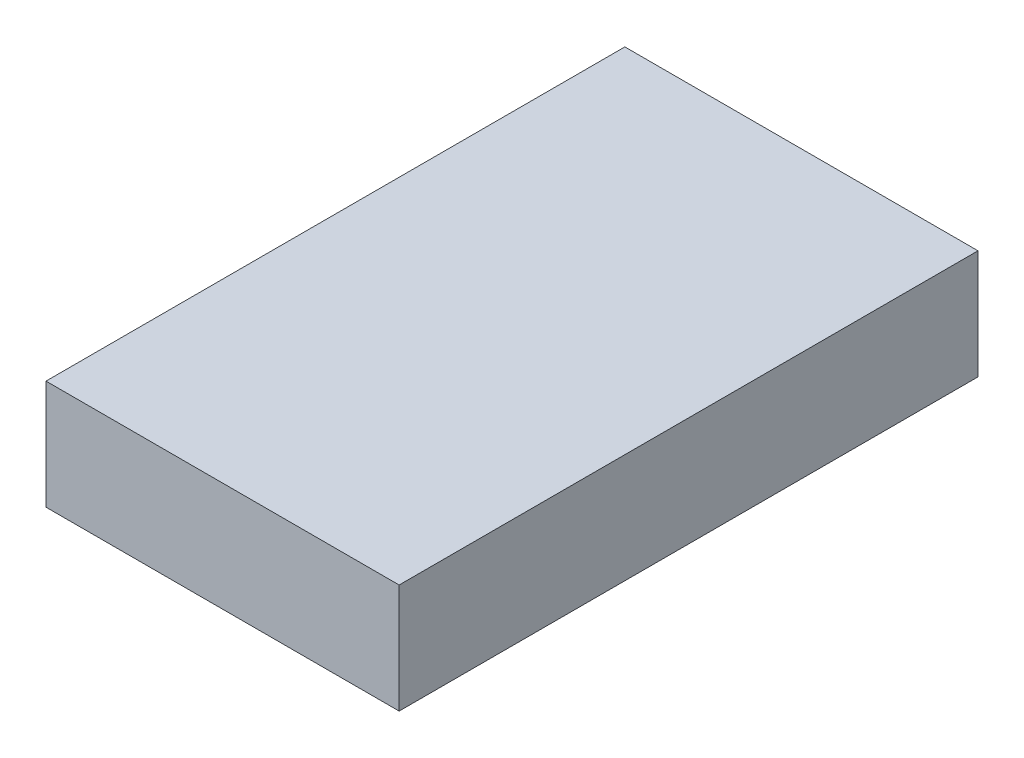
ISO-10303-21;
HEADER;
FILE_DESCRIPTION(('STEP AP214'),'2;1');
FILE_NAME('part.step','',(''),(''),'','','');
FILE_SCHEMA(('AUTOMOTIVE_DESIGN { 1 0 10303 214 1 1 1 1 }'));
ENDSEC;
DATA;
#1=APPLICATION_CONTEXT('core data for automotive mechanical design processes');
#2=APPLICATION_PROTOCOL_DEFINITION('international standard','automotive_design',2000,#1);
#3=PRODUCT_CONTEXT('',#1,'mechanical');
#4=PRODUCT('Part','Part','',(#3));
#5=PRODUCT_RELATED_PRODUCT_CATEGORY('part','',(#4));
#6=PRODUCT_DEFINITION_FORMATION('','',#4);
#7=PRODUCT_DEFINITION_CONTEXT('part definition',#1,'design');
#8=PRODUCT_DEFINITION('design','',#6,#7);
#9=PRODUCT_DEFINITION_SHAPE('','',#8);
#10=(LENGTH_UNIT() NAMED_UNIT(*) SI_UNIT(.MILLI.,.METRE.));
#11=(NAMED_UNIT(*) PLANE_ANGLE_UNIT() SI_UNIT($,.RADIAN.));
#12=(NAMED_UNIT(*) SI_UNIT($,.STERADIAN.) SOLID_ANGLE_UNIT());
#13=UNCERTAINTY_MEASURE_WITH_UNIT(LENGTH_MEASURE(1.E-05),#10,'distance_accuracy_value','');
#14=(GEOMETRIC_REPRESENTATION_CONTEXT(3) GLOBAL_UNCERTAINTY_ASSIGNED_CONTEXT((#13)) GLOBAL_UNIT_ASSIGNED_CONTEXT((#10,
#11,#12)) REPRESENTATION_CONTEXT('',''));
#15=CARTESIAN_POINT('',(0.,0.,0.));
#16=DIRECTION('',(0.,0.,1.));
#17=DIRECTION('',(1.,0.,0.));
#18=AXIS2_PLACEMENT_3D('',#15,#16,#17);
#19=CARTESIAN_POINT('',(-48.5,30.,-79.5));
#20=DIRECTION('',(1.,0.,0.));
#21=DIRECTION('',(0.,0.,-1.));
#22=AXIS2_PLACEMENT_3D('',#19,#20,#21);
#23=PLANE('',#22);
#24=DIRECTION('',(0.,0.,1.));
#25=VECTOR('',#24,1.);
#26=CARTESIAN_POINT('',(-48.5,0.,-79.5));
#27=LINE('',#26,#25);
#28=CARTESIAN_POINT('',(-48.5,0.,-79.5));
#29=VERTEX_POINT('',#28);
#30=CARTESIAN_POINT('',(-48.5,0.,79.5));
#31=VERTEX_POINT('',#30);
#32=EDGE_CURVE('E96',#29,#31,#27,.T.);
#33=ORIENTED_EDGE('',*,*,#32,.T.);
#34=DIRECTION('',(0.,-1.,0.));
#35=VECTOR('',#34,1.);
#36=CARTESIAN_POINT('',(-48.5,30.,79.5));
#37=LINE('',#36,#35);
#38=CARTESIAN_POINT('',(-48.5,30.,79.5));
#39=VERTEX_POINT('',#38);
#40=EDGE_CURVE('E11',#39,#31,#37,.T.);
#41=ORIENTED_EDGE('',*,*,#40,.F.);
#42=DIRECTION('',(0.,0.,1.));
#43=VECTOR('',#42,1.);
#44=CARTESIAN_POINT('',(-48.5,30.,-79.5));
#45=LINE('',#44,#43);
#46=CARTESIAN_POINT('',(-48.5,30.,-79.5));
#47=VERTEX_POINT('',#46);
#48=EDGE_CURVE('E84',#47,#39,#45,.T.);
#49=ORIENTED_EDGE('',*,*,#48,.F.);
#50=DIRECTION('',(0.,-1.,0.));
#51=VECTOR('',#50,1.);
#52=CARTESIAN_POINT('',(-48.5,30.,-79.5));
#53=LINE('',#52,#51);
#54=EDGE_CURVE('E92',#47,#29,#53,.T.);
#55=ORIENTED_EDGE('',*,*,#54,.T.);
#56=EDGE_LOOP('',(#33,#41,#49,#55));
#57=FACE_BOUND('',#56,.T.);
#58=ADVANCED_FACE('F33',(#57),#23,.F.);
#59=CARTESIAN_POINT('',(48.5,30.,79.5));
#60=DIRECTION('',(0.,0.,-1.));
#61=DIRECTION('',(-1.,0.,0.));
#62=AXIS2_PLACEMENT_3D('',#59,#60,#61);
#63=PLANE('',#62);
#64=DIRECTION('',(1.,0.,0.));
#65=VECTOR('',#64,1.);
#66=CARTESIAN_POINT('',(48.5,0.,79.5));
#67=LINE('',#66,#65);
#68=CARTESIAN_POINT('',(48.5,0.,79.5));
#69=VERTEX_POINT('',#68);
#70=EDGE_CURVE('E88',#31,#69,#67,.T.);
#71=ORIENTED_EDGE('',*,*,#70,.T.);
#72=DIRECTION('',(0.,-1.,0.));
#73=VECTOR('',#72,1.);
#74=CARTESIAN_POINT('',(48.5,30.,79.5));
#75=LINE('',#74,#73);
#76=CARTESIAN_POINT('',(48.5,30.,79.5));
#77=VERTEX_POINT('',#76);
#78=EDGE_CURVE('E41',#77,#69,#75,.T.);
#79=ORIENTED_EDGE('',*,*,#78,.F.);
#80=DIRECTION('',(1.,0.,0.));
#81=VECTOR('',#80,1.);
#82=CARTESIAN_POINT('',(48.5,30.,79.5));
#83=LINE('',#82,#81);
#84=EDGE_CURVE('E79',#39,#77,#83,.T.);
#85=ORIENTED_EDGE('',*,*,#84,.F.);
#86=ORIENTED_EDGE('',*,*,#40,.T.);
#87=EDGE_LOOP('',(#71,#79,#85,#86));
#88=FACE_BOUND('',#87,.T.);
#89=ADVANCED_FACE('F87',(#88),#63,.F.);
#90=CARTESIAN_POINT('',(48.5,30.,-79.5));
#91=DIRECTION('',(-1.,0.,0.));
#92=DIRECTION('',(0.,0.,1.));
#93=AXIS2_PLACEMENT_3D('',#90,#91,#92);
#94=PLANE('',#93);
#95=DIRECTION('',(0.,0.,-1.));
#96=VECTOR('',#95,1.);
#97=CARTESIAN_POINT('',(48.5,0.,-79.5));
#98=LINE('',#97,#96);
#99=CARTESIAN_POINT('',(48.5,0.,-79.5));
#100=VERTEX_POINT('',#99);
#101=EDGE_CURVE('E66',#69,#100,#98,.T.);
#102=ORIENTED_EDGE('',*,*,#101,.T.);
#103=DIRECTION('',(0.,-1.,0.));
#104=VECTOR('',#103,1.);
#105=CARTESIAN_POINT('',(48.5,30.,-79.5));
#106=LINE('',#105,#104);
#107=CARTESIAN_POINT('',(48.5,30.,-79.5));
#108=VERTEX_POINT('',#107);
#109=EDGE_CURVE('E89',#108,#100,#106,.T.);
#110=ORIENTED_EDGE('',*,*,#109,.F.);
#111=DIRECTION('',(0.,0.,-1.));
#112=VECTOR('',#111,1.);
#113=CARTESIAN_POINT('',(48.5,30.,-79.5));
#114=LINE('',#113,#112);
#115=EDGE_CURVE('E82',#77,#108,#114,.T.);
#116=ORIENTED_EDGE('',*,*,#115,.F.);
#117=ORIENTED_EDGE('',*,*,#78,.T.);
#118=EDGE_LOOP('',(#102,#110,#116,#117));
#119=FACE_BOUND('',#118,.T.);
#120=ADVANCED_FACE('F90',(#119),#94,.F.);
#121=CARTESIAN_POINT('',(48.5,30.,-79.5));
#122=DIRECTION('',(0.,0.,1.));
#123=DIRECTION('',(1.,0.,0.));
#124=AXIS2_PLACEMENT_3D('',#121,#122,#123);
#125=PLANE('',#124);
#126=DIRECTION('',(-1.,0.,0.));
#127=VECTOR('',#126,1.);
#128=CARTESIAN_POINT('',(48.5,0.,-79.5));
#129=LINE('',#128,#127);
#130=EDGE_CURVE('E72',#100,#29,#129,.T.);
#131=ORIENTED_EDGE('',*,*,#130,.T.);
#132=ORIENTED_EDGE('',*,*,#54,.F.);
#133=DIRECTION('',(-1.,0.,0.));
#134=VECTOR('',#133,1.);
#135=CARTESIAN_POINT('',(48.5,30.,-79.5));
#136=LINE('',#135,#134);
#137=EDGE_CURVE('E49',#108,#47,#136,.T.);
#138=ORIENTED_EDGE('',*,*,#137,.F.);
#139=ORIENTED_EDGE('',*,*,#109,.T.);
#140=EDGE_LOOP('',(#131,#132,#138,#139));
#141=FACE_BOUND('',#140,.T.);
#142=ADVANCED_FACE('F103',(#141),#125,.F.);
#143=CARTESIAN_POINT('',(0.,30.,0.));
#144=DIRECTION('',(0.,-1.,0.));
#145=DIRECTION('',(0.,0.,-1.));
#146=AXIS2_PLACEMENT_3D('',#143,#144,#145);
#147=PLANE('',#146);
#148=ORIENTED_EDGE('',*,*,#48,.T.);
#149=ORIENTED_EDGE('',*,*,#84,.T.);
#150=ORIENTED_EDGE('',*,*,#115,.T.);
#151=ORIENTED_EDGE('',*,*,#137,.T.);
#152=EDGE_LOOP('',(#148,#149,#150,#151));
#153=FACE_BOUND('',#152,.T.);
#154=ADVANCED_FACE('F80',(#153),#147,.F.);
#155=CARTESIAN_POINT('',(0.,0.,0.));
#156=DIRECTION('',(0.,-1.,0.));
#157=DIRECTION('',(0.,0.,-1.));
#158=AXIS2_PLACEMENT_3D('',#155,#156,#157);
#159=PLANE('',#158);
#160=ORIENTED_EDGE('',*,*,#32,.F.);
#161=ORIENTED_EDGE('',*,*,#130,.F.);
#162=ORIENTED_EDGE('',*,*,#101,.F.);
#163=ORIENTED_EDGE('',*,*,#70,.F.);
#164=EDGE_LOOP('',(#160,#161,#162,#163));
#165=FACE_BOUND('',#164,.T.);
#166=ADVANCED_FACE('F106',(#165),#159,.T.);
#167=CLOSED_SHELL('',(#58,#89,#120,#142,#154,#166));
#168=MANIFOLD_SOLID_BREP('B2',#167);
#169=ADVANCED_BREP_SHAPE_REPRESENTATION('',(#18,#168),#14);
#170=SHAPE_DEFINITION_REPRESENTATION(#9,#169);
ENDSEC;
END-ISO-10303-21;
